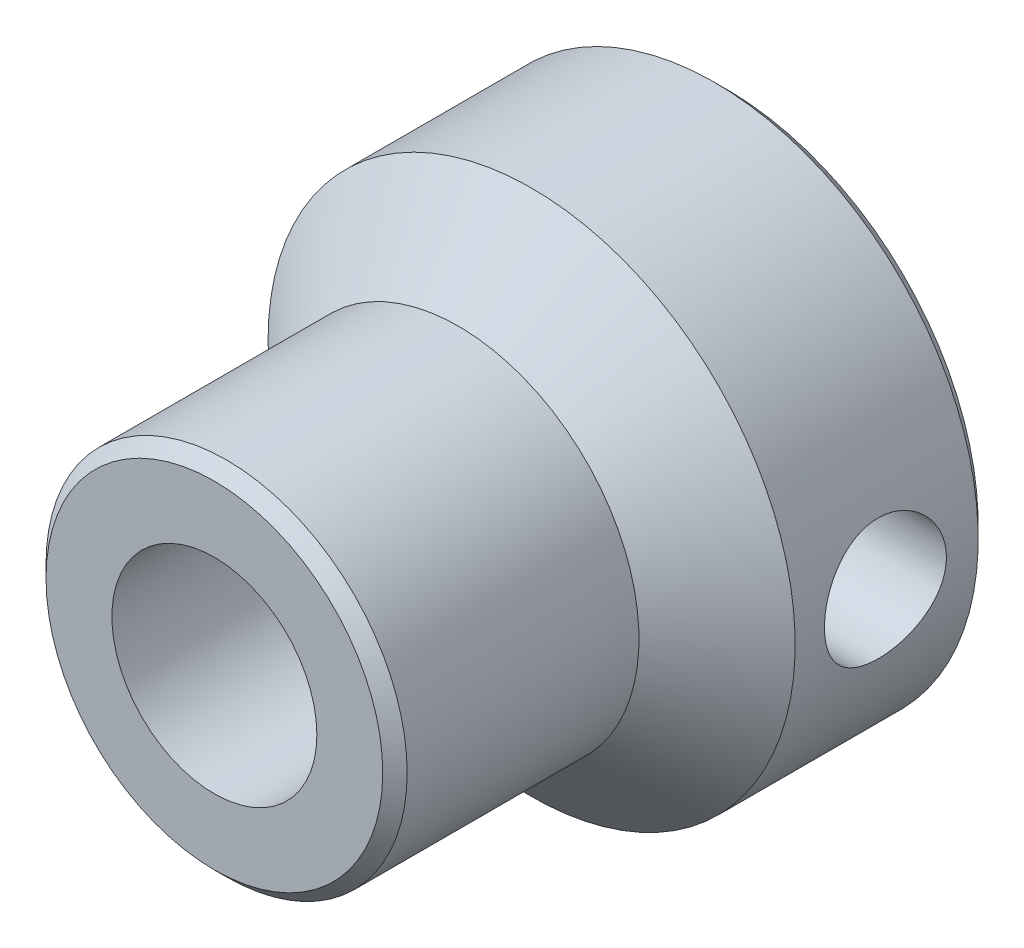
ISO-10303-21;
HEADER;
FILE_DESCRIPTION(('STEP AP214'),'2;1');
FILE_NAME('part.step','',(''),(''),'','','');
FILE_SCHEMA(('AUTOMOTIVE_DESIGN { 1 0 10303 214 1 1 1 1 }'));
ENDSEC;
DATA;
#1=APPLICATION_CONTEXT('core data for automotive mechanical design processes');
#2=APPLICATION_PROTOCOL_DEFINITION('international standard','automotive_design',2000,#1);
#3=PRODUCT_CONTEXT('',#1,'mechanical');
#4=PRODUCT('Part','Part','',(#3));
#5=PRODUCT_RELATED_PRODUCT_CATEGORY('part','',(#4));
#6=PRODUCT_DEFINITION_FORMATION('','',#4);
#7=PRODUCT_DEFINITION_CONTEXT('part definition',#1,'design');
#8=PRODUCT_DEFINITION('design','',#6,#7);
#9=PRODUCT_DEFINITION_SHAPE('','',#8);
#10=(LENGTH_UNIT() NAMED_UNIT(*) SI_UNIT(.MILLI.,.METRE.));
#11=(NAMED_UNIT(*) PLANE_ANGLE_UNIT() SI_UNIT($,.RADIAN.));
#12=(NAMED_UNIT(*) SI_UNIT($,.STERADIAN.) SOLID_ANGLE_UNIT());
#13=UNCERTAINTY_MEASURE_WITH_UNIT(LENGTH_MEASURE(1.E-05),#10,'distance_accuracy_value','');
#14=(GEOMETRIC_REPRESENTATION_CONTEXT(3) GLOBAL_UNCERTAINTY_ASSIGNED_CONTEXT((#13)) GLOBAL_UNIT_ASSIGNED_CONTEXT((#10,
#11,#12)) REPRESENTATION_CONTEXT('',''));
#15=CARTESIAN_POINT('',(0.,0.,0.));
#16=DIRECTION('',(0.,0.,1.));
#17=DIRECTION('',(1.,0.,0.));
#18=AXIS2_PLACEMENT_3D('',#15,#16,#17);
#19=CARTESIAN_POINT('',(0.,0.,0.));
#20=DIRECTION('',(0.,0.,-1.));
#21=DIRECTION('',(-1.,0.,0.));
#22=AXIS2_PLACEMENT_3D('',#19,#20,#21);
#23=CYLINDRICAL_SURFACE('',#22,2.5);
#24=CARTESIAN_POINT('',(-2.5,0.,3.4));
#25=CARTESIAN_POINT('',(-2.49999641755189,-0.065714953691233,3.39999587210062));
#26=CARTESIAN_POINT('',(-2.49738113774397,-0.131508249622541,3.3947874085979));
#27=CARTESIAN_POINT('',(-2.48717695046745,-0.261150294085531,3.37418389957385));
#28=CARTESIAN_POINT('',(-2.47957859786229,-0.324995108391879,3.35876950875294));
#29=CARTESIAN_POINT('',(-2.4602034925414,-0.448666931100718,3.31850773922901));
#30=CARTESIAN_POINT('',(-2.448442989719,-0.508508503673975,3.29369701968998));
#31=CARTESIAN_POINT('',(-2.42182220644723,-0.623090771008206,3.23553672329382));
#32=CARTESIAN_POINT('',(-2.40696217041913,-0.677831867487562,3.20218781968893));
#33=CARTESIAN_POINT('',(-2.37445322822571,-0.784384772202398,3.12560343814338));
#34=CARTESIAN_POINT('',(-2.3566899890942,-0.835819013902639,3.08189190095045));
#35=CARTESIAN_POINT('',(-2.32074962808431,-0.93097430608372,2.98684815094121));
#36=CARTESIAN_POINT('',(-2.30257220261294,-0.974689478883457,2.93551018528445));
#37=CARTESIAN_POINT('',(-2.26623688996684,-1.05656500056285,2.82189581309577));
#38=CARTESIAN_POINT('',(-2.24818983712665,-1.09403166943955,2.75907987706761));
#39=CARTESIAN_POINT('',(-2.21607473465401,-1.15771028361337,2.62704083001723));
#40=CARTESIAN_POINT('',(-2.20200384508737,-1.18393026870792,2.55782233909656));
#41=CARTESIAN_POINT('',(-2.18072333797261,-1.22266555273573,2.4191686182226));
#42=CARTESIAN_POINT('',(-2.17315339479642,-1.23590732135055,2.34999443491576));
#43=CARTESIAN_POINT('',(-2.1647736243566,-1.25053374163606,2.21002645277565));
#44=CARTESIAN_POINT('',(-2.1639571167911,-1.25193011046634,2.13923432391106));
#45=CARTESIAN_POINT('',(-2.16888662821561,-1.24335910896537,2.00714246960579));
#46=CARTESIAN_POINT('',(-2.17385954577517,-1.23473069942103,1.94571996097119));
#47=CARTESIAN_POINT('',(-2.18845285917313,-1.20867481132116,1.8253476132837));
#48=CARTESIAN_POINT('',(-2.1980747353972,-1.19124452987206,1.76639856836836));
#49=CARTESIAN_POINT('',(-2.22109345515926,-1.1477622254825,1.65096358429293));
#50=CARTESIAN_POINT('',(-2.23457300829998,-1.12151883389499,1.59456700151776));
#51=CARTESIAN_POINT('',(-2.26379255351755,-1.061302109585,1.48670713426249));
#52=CARTESIAN_POINT('',(-2.27953355975238,-1.02732530476558,1.43524608049989));
#53=CARTESIAN_POINT('',(-2.31391447379107,-0.947582568640985,1.33184843407097));
#54=CARTESIAN_POINT('',(-2.33266887795933,-0.900868072961601,1.2806789080298));
#55=CARTESIAN_POINT('',(-2.36934529125509,-0.799444473426716,1.18658072676137));
#56=CARTESIAN_POINT('',(-2.38726689948501,-0.744731570717856,1.14365600995765));
#57=CARTESIAN_POINT('',(-2.42127484103705,-0.62564563228981,1.06539292371284));
#58=CARTESIAN_POINT('',(-2.43723730202509,-0.56094198949926,1.03049940944283));
#59=CARTESIAN_POINT('',(-2.46447351401553,-0.425582769360996,0.97237871369624));
#60=CARTESIAN_POINT('',(-2.47575098679441,-0.354931970331596,0.949142268731042));
#61=CARTESIAN_POINT('',(-2.49155417176795,-0.215958114575877,0.916905745354157));
#62=CARTESIAN_POINT('',(-2.4965617287664,-0.147926913185405,0.906885955316528));
#63=CARTESIAN_POINT('',(-2.50091266823877,-0.0109744999366921,0.898169086081889));
#64=CARTESIAN_POINT('',(-2.5002587340164,0.0579462748373765,0.899466642950652));
#65=CARTESIAN_POINT('',(-2.49363990316801,0.189041214982491,0.912758360523443));
#66=CARTESIAN_POINT('',(-2.48809057110237,0.251324260062442,0.923915665912539));
#67=CARTESIAN_POINT('',(-2.47277714143524,0.373008615377395,0.955297589868858));
#68=CARTESIAN_POINT('',(-2.46301257917916,0.432409607113745,0.9755232080667));
#69=CARTESIAN_POINT('',(-2.43980314267087,0.548610760562081,1.02499808304147));
#70=CARTESIAN_POINT('',(-2.42626102212424,0.605287996257691,1.05448881264602));
#71=CARTESIAN_POINT('',(-2.39679967896386,0.71307670212365,1.12138441955755));
#72=CARTESIAN_POINT('',(-2.38087944457231,0.764185787219101,1.15879266824179));
#73=CARTESIAN_POINT('',(-2.34635276671831,0.864709611613315,1.24470053166609));
#74=CARTESIAN_POINT('',(-2.32763606060552,0.913465097280798,1.29392858556696));
#75=CARTESIAN_POINT('',(-2.29077989504843,1.00232040139155,1.39990643908663));
#76=CARTESIAN_POINT('',(-2.27264084226908,1.04241423211355,1.45666139852047));
#77=CARTESIAN_POINT('',(-2.23813990282585,1.11463489312212,1.57955456775039));
#78=CARTESIAN_POINT('',(-2.2219066207934,1.1462818698483,1.64601408276074));
#79=CARTESIAN_POINT('',(-2.19467590460158,1.19760353251725,1.78438758461565));
#80=CARTESIAN_POINT('',(-2.18367172800773,1.21729364485946,1.85629440812648));
#81=CARTESIAN_POINT('',(-2.16951876260834,1.2423271093121,1.99613777857681));
#82=CARTESIAN_POINT('',(-2.16571729325614,1.24886624550108,2.06379281678629));
#83=CARTESIAN_POINT('',(-2.16456693307719,1.25086144297598,2.19930883396341));
#84=CARTESIAN_POINT('',(-2.16721524534441,1.2463223082805,2.26716971092429));
#85=CARTESIAN_POINT('',(-2.17797327562531,1.22740765699033,2.39435437691502));
#86=CARTESIAN_POINT('',(-2.18553868102992,1.2140103929285,2.4538755876805));
#87=CARTESIAN_POINT('',(-2.20463770234897,1.17896919778081,2.56976014928088));
#88=CARTESIAN_POINT('',(-2.21617259462095,1.15732261394976,2.62612247761496));
#89=CARTESIAN_POINT('',(-2.2428566295566,1.10476968162585,2.73828106373326));
#90=CARTESIAN_POINT('',(-2.25819652995238,1.07333892227057,2.79378487728713));
#91=CARTESIAN_POINT('',(-2.29044164543238,1.00268871454579,2.89909317022573));
#92=CARTESIAN_POINT('',(-2.30734767243153,0.963465214048309,2.94889466314811));
#93=CARTESIAN_POINT('',(-2.34327903949141,0.872754158330801,3.04767747794702));
#94=CARTESIAN_POINT('',(-2.36231229139336,0.820355528762713,3.0958238779524));
#95=CARTESIAN_POINT('',(-2.3984719031886,0.707693507775349,3.18282872927954));
#96=CARTESIAN_POINT('',(-2.4155972326005,0.647425904070981,3.22168217428286));
#97=CARTESIAN_POINT('',(-2.44622511981379,0.519914496024933,3.28904545345275));
#98=CARTESIAN_POINT('',(-2.45970120703636,0.452624379918267,3.31748021176429));
#99=CARTESIAN_POINT('',(-2.48126676704332,0.313427626617739,3.36226020989869));
#100=CARTESIAN_POINT('',(-2.48937154216165,0.241534749528957,3.37863980853697));
#101=CARTESIAN_POINT('',(-2.49619327387079,0.14075243310423,3.39237176384481));
#102=CARTESIAN_POINT('',(-2.49761706674002,0.112702349299373,3.39522830107952));
#103=CARTESIAN_POINT('',(-2.49952121222331,0.0564396647589469,3.39904333189601));
#104=CARTESIAN_POINT('',(-2.50000153879704,0.0282270595592267,3.400001773089));
#105=CARTESIAN_POINT('',(-2.5,0.,3.4));
#106=B_SPLINE_CURVE_WITH_KNOTS('',3,(#24,#25,#26,#27,#28,#29,#30,#31,#32,#33,#34,#35,#36,#37,
#38,#39,#40,#41,#42,#43,#44,#45,#46,#47,#48,#49,#50,#51,#52,#53,#54,#55,#56,#57,#58,#59,#60,#61,
#62,#63,#64,#65,#66,#67,#68,#69,#70,#71,#72,#73,#74,#75,#76,#77,#78,#79,#80,#81,#82,#83,#84,#85,
#86,#87,#88,#89,#90,#91,#92,#93,#94,#95,#96,#97,#98,#99,#100,#101,#102,#103,#104,#105),
.UNSPECIFIED.,.T.,.F.,(4,2,2,2,2,2,2,2,2,2,2,2,2,2,2,2,2,2,2,2,2,2,2,2,2,2,2,2,2,2,2,2,2,2,2,2,
2,2,2,2,4),(0.,0.197030321775365,0.394435187136497,0.591077694365372,0.787704700726959,
0.99622719839761,1.20490779706754,1.42977158038441,1.65447434872851,1.86572515175287,
2.07676696661275,2.2625714051165,2.44843504907098,2.63862800210609,2.82890651575277,
3.04331176667348,3.25781918248357,3.4822877776805,3.70657771140349,3.91229113089182,
4.11790705639345,4.30758633132652,4.49728652038664,4.69241070034873,4.88761813435424,
5.10199513305523,5.31651985769289,5.54143352699592,5.76605639925971,5.96911634372966,
6.17208824825006,6.35572412805228,6.53941910979597,6.73545570969517,6.93159451423697,
7.15156553440622,7.37165479220715,7.59330017078656,7.81431135781162,7.89894100172121,
7.98357298143558),.UNSPECIFIED.);
#107=CARTESIAN_POINT('',(-2.5,0.,3.4));
#108=VERTEX_POINT('',#107);
#109=EDGE_CURVE('E278',#108,#108,#106,.T.);
#110=ORIENTED_EDGE('',*,*,#109,.F.);
#111=EDGE_LOOP('',(#110));
#112=FACE_BOUND('',#111,.T.);
#113=CARTESIAN_POINT('',(2.5,0.,0.900000000000001));
#114=CARTESIAN_POINT('',(2.49999641755189,-0.065714953691233,0.900004127899377));
#115=CARTESIAN_POINT('',(2.49738113774397,-0.13150824962254,0.905212591402095));
#116=CARTESIAN_POINT('',(2.48717695046745,-0.261150294085531,0.925816100426148));
#117=CARTESIAN_POINT('',(2.47957859786229,-0.324995108391879,0.941230491247063));
#118=CARTESIAN_POINT('',(2.4602034925414,-0.448666931100718,0.981492260770994));
#119=CARTESIAN_POINT('',(2.448442989719,-0.508508503673974,1.00630298031002));
#120=CARTESIAN_POINT('',(2.42182220644723,-0.623090771008206,1.06446327670618));
#121=CARTESIAN_POINT('',(2.40696217041913,-0.677831867487562,1.09781218031107));
#122=CARTESIAN_POINT('',(2.37445322822571,-0.784384772202398,1.17439656185662));
#123=CARTESIAN_POINT('',(2.3566899890942,-0.835819013902639,1.21810809904955));
#124=CARTESIAN_POINT('',(2.32074962808431,-0.930974306083721,1.31315184905879));
#125=CARTESIAN_POINT('',(2.30257220261294,-0.974689478883457,1.36448981471555));
#126=CARTESIAN_POINT('',(2.26623688996684,-1.05656500056285,1.47810418690423));
#127=CARTESIAN_POINT('',(2.24818983712665,-1.09403166943955,1.54092012293239));
#128=CARTESIAN_POINT('',(2.21607473465401,-1.15771028361337,1.67295916998277));
#129=CARTESIAN_POINT('',(2.20200384508737,-1.18393026870792,1.74217766090344));
#130=CARTESIAN_POINT('',(2.18072333797261,-1.22266555273573,1.8808313817774));
#131=CARTESIAN_POINT('',(2.17315339479642,-1.23590732135055,1.95000556508424));
#132=CARTESIAN_POINT('',(2.1647736243566,-1.25053374163606,2.08997354722435));
#133=CARTESIAN_POINT('',(2.1639571167911,-1.25193011046634,2.16076567608894));
#134=CARTESIAN_POINT('',(2.16888662821561,-1.24335910896537,2.29285753039421));
#135=CARTESIAN_POINT('',(2.17385954577517,-1.23473069942103,2.35428003902881));
#136=CARTESIAN_POINT('',(2.18845285917313,-1.20867481132116,2.4746523867163));
#137=CARTESIAN_POINT('',(2.1980747353972,-1.19124452987206,2.53360143163164));
#138=CARTESIAN_POINT('',(2.22109345515926,-1.1477622254825,2.64903641570707));
#139=CARTESIAN_POINT('',(2.23457300829998,-1.12151883389499,2.70543299848224));
#140=CARTESIAN_POINT('',(2.26379255351755,-1.061302109585,2.81329286573751));
#141=CARTESIAN_POINT('',(2.27953355975238,-1.02732530476558,2.86475391950011));
#142=CARTESIAN_POINT('',(2.31391447379107,-0.947582568640985,2.96815156592903));
#143=CARTESIAN_POINT('',(2.33266887795933,-0.900868072961601,3.0193210919702));
#144=CARTESIAN_POINT('',(2.36934529125509,-0.799444473426716,3.11341927323863));
#145=CARTESIAN_POINT('',(2.38726689948501,-0.744731570717856,3.15634399004235));
#146=CARTESIAN_POINT('',(2.42127484103705,-0.62564563228981,3.23460707628716));
#147=CARTESIAN_POINT('',(2.43723730202509,-0.56094198949926,3.26950059055717));
#148=CARTESIAN_POINT('',(2.46447351401553,-0.425582769360996,3.32762128630376));
#149=CARTESIAN_POINT('',(2.47575098679441,-0.354931970331595,3.35085773126896));
#150=CARTESIAN_POINT('',(2.49155417176795,-0.215958114575877,3.38309425464584));
#151=CARTESIAN_POINT('',(2.4965617287664,-0.147926913185405,3.39311404468347));
#152=CARTESIAN_POINT('',(2.50091266823877,-0.0109744999366919,3.40183091391811));
#153=CARTESIAN_POINT('',(2.5002587340164,0.0579462748373767,3.40053335704935));
#154=CARTESIAN_POINT('',(2.49363990316801,0.189041214982492,3.38724163947656));
#155=CARTESIAN_POINT('',(2.48809057110237,0.251324260062442,3.37608433408746));
#156=CARTESIAN_POINT('',(2.47277714143524,0.373008615377395,3.34470241013114));
#157=CARTESIAN_POINT('',(2.46301257917916,0.432409607113746,3.3244767919333));
#158=CARTESIAN_POINT('',(2.43980314267087,0.548610760562081,3.27500191695853));
#159=CARTESIAN_POINT('',(2.42626102212424,0.605287996257692,3.24551118735398));
#160=CARTESIAN_POINT('',(2.39679967896386,0.713076702123651,3.17861558044245));
#161=CARTESIAN_POINT('',(2.38087944457231,0.764185787219102,3.14120733175821));
#162=CARTESIAN_POINT('',(2.34635276671831,0.864709611613316,3.05529946833391));
#163=CARTESIAN_POINT('',(2.32763606060552,0.913465097280798,3.00607141443304));
#164=CARTESIAN_POINT('',(2.29077989504843,1.00232040139155,2.90009356091337));
#165=CARTESIAN_POINT('',(2.27264084226908,1.04241423211355,2.84333860147953));
#166=CARTESIAN_POINT('',(2.23813990282585,1.11463489312212,2.72044543224961));
#167=CARTESIAN_POINT('',(2.2219066207934,1.1462818698483,2.65398591723926));
#168=CARTESIAN_POINT('',(2.19467590460158,1.19760353251725,2.51561241538435));
#169=CARTESIAN_POINT('',(2.18367172800773,1.21729364485946,2.44370559187352));
#170=CARTESIAN_POINT('',(2.16951876260834,1.2423271093121,2.30386222142319));
#171=CARTESIAN_POINT('',(2.16571729325614,1.24886624550108,2.2362071832137));
#172=CARTESIAN_POINT('',(2.16456693307719,1.25086144297598,2.10069116603659));
#173=CARTESIAN_POINT('',(2.16721524534441,1.2463223082805,2.03283028907571));
#174=CARTESIAN_POINT('',(2.17797327562531,1.22740765699033,1.90564562308498));
#175=CARTESIAN_POINT('',(2.18553868102992,1.2140103929285,1.8461244123195));
#176=CARTESIAN_POINT('',(2.20463770234897,1.17896919778081,1.73023985071912));
#177=CARTESIAN_POINT('',(2.21617259462095,1.15732261394976,1.67387752238504));
#178=CARTESIAN_POINT('',(2.2428566295566,1.10476968162585,1.56171893626674));
#179=CARTESIAN_POINT('',(2.25819652995238,1.07333892227057,1.50621512271287));
#180=CARTESIAN_POINT('',(2.29044164543238,1.00268871454579,1.40090682977427));
#181=CARTESIAN_POINT('',(2.30734767243153,0.963465214048309,1.35110533685189));
#182=CARTESIAN_POINT('',(2.34327903949141,0.8727541583308,1.25232252205298));
#183=CARTESIAN_POINT('',(2.36231229139336,0.820355528762713,1.2041761220476));
#184=CARTESIAN_POINT('',(2.3984719031886,0.707693507775349,1.11717127072046));
#185=CARTESIAN_POINT('',(2.4155972326005,0.64742590407098,1.07831782571714));
#186=CARTESIAN_POINT('',(2.44622511981379,0.519914496024933,1.01095454654725));
#187=CARTESIAN_POINT('',(2.45970120703636,0.452624379918267,0.982519788235708));
#188=CARTESIAN_POINT('',(2.48126676704332,0.313427626617739,0.937739790101311));
#189=CARTESIAN_POINT('',(2.48937154216165,0.241534749528957,0.921360191463029));
#190=CARTESIAN_POINT('',(2.49619327387079,0.140752433104229,0.907628236155189));
#191=CARTESIAN_POINT('',(2.49761706674002,0.112702349299373,0.904771698920477));
#192=CARTESIAN_POINT('',(2.49952121222331,0.0564396647589469,0.900956668103994));
#193=CARTESIAN_POINT('',(2.50000153879704,0.0282270595592266,0.899998226911001));
#194=CARTESIAN_POINT('',(2.5,0.,0.900000000000001));
#195=B_SPLINE_CURVE_WITH_KNOTS('',3,(#113,#114,#115,#116,#117,#118,#119,#120,#121,#122,#123,
#124,#125,#126,#127,#128,#129,#130,#131,#132,#133,#134,#135,#136,#137,#138,#139,#140,#141,#142,
#143,#144,#145,#146,#147,#148,#149,#150,#151,#152,#153,#154,#155,#156,#157,#158,#159,#160,#161,
#162,#163,#164,#165,#166,#167,#168,#169,#170,#171,#172,#173,#174,#175,#176,#177,#178,#179,#180,
#181,#182,#183,#184,#185,#186,#187,#188,#189,#190,#191,#192,#193,#194),.UNSPECIFIED.,.T.,.F.,(4,
2,2,2,2,2,2,2,2,2,2,2,2,2,2,2,2,2,2,2,2,2,2,2,2,2,2,2,2,2,2,2,2,2,2,2,2,2,2,2,4),(0.,
0.197030321775365,0.394435187136497,0.591077694365372,0.787704700726959,0.99622719839761,
1.20490779706754,1.42977158038441,1.65447434872851,1.86572515175287,2.07676696661275,
2.26257140511651,2.44843504907098,2.63862800210609,2.82890651575277,3.04331176667348,
3.25781918248358,3.4822877776805,3.70657771140349,3.91229113089182,4.11790705639345,
4.30758633132652,4.49728652038664,4.69241070034873,4.88761813435424,5.10199513305523,
5.31651985769289,5.54143352699592,5.76605639925972,5.96911634372966,6.17208824825006,
6.35572412805228,6.53941910979597,6.73545570969517,6.93159451423697,7.15156553440623,
7.37165479220715,7.59330017078656,7.81431135781162,7.89894100172122,7.98357298143558),.UNSPECIFIED.);
#196=CARTESIAN_POINT('',(2.5,0.,0.900000000000001));
#197=VERTEX_POINT('',#196);
#198=EDGE_CURVE('E89',#197,#197,#195,.T.);
#199=ORIENTED_EDGE('',*,*,#198,.F.);
#200=EDGE_LOOP('',(#199));
#201=FACE_BOUND('',#200,.T.);
#202=CARTESIAN_POINT('',(0.,0.,0.));
#203=DIRECTION('',(0.,0.,-1.));
#204=DIRECTION('',(-1.,0.,0.));
#205=AXIS2_PLACEMENT_3D('',#202,#203,#204);
#206=CIRCLE('',#205,2.5);
#207=CARTESIAN_POINT('',(-2.5,0.,0.));
#208=VERTEX_POINT('',#207);
#209=EDGE_CURVE('E72',#208,#208,#206,.T.);
#210=ORIENTED_EDGE('',*,*,#209,.T.);
#211=EDGE_LOOP('',(#210));
#212=FACE_BOUND('',#211,.T.);
#213=CARTESIAN_POINT('',(0.,0.,5.));
#214=DIRECTION('',(0.,0.,-1.));
#215=DIRECTION('',(-1.,0.,0.));
#216=AXIS2_PLACEMENT_3D('',#213,#214,#215);
#217=CIRCLE('',#216,2.5);
#218=CARTESIAN_POINT('',(-2.5,0.,5.));
#219=VERTEX_POINT('',#218);
#220=EDGE_CURVE('E63',#219,#219,#217,.T.);
#221=ORIENTED_EDGE('',*,*,#220,.F.);
#222=EDGE_LOOP('',(#221));
#223=FACE_BOUND('',#222,.T.);
#224=ADVANCED_FACE('F42',(#112,#201,#212,#223),#23,.F.);
#225=CARTESIAN_POINT('',(-1.,0.,5.));
#226=DIRECTION('',(0.,0.,-1.));
#227=DIRECTION('',(-1.,0.,0.));
#228=AXIS2_PLACEMENT_3D('',#225,#226,#227);
#229=PLANE('',#228);
#230=CARTESIAN_POINT('',(0.,0.,5.));
#231=DIRECTION('',(0.,0.,-1.));
#232=DIRECTION('',(-1.,0.,0.));
#233=AXIS2_PLACEMENT_3D('',#230,#231,#232);
#234=CIRCLE('',#233,2.09999999999999);
#235=CARTESIAN_POINT('',(-2.09999999999999,0.,5.));
#236=VERTEX_POINT('',#235);
#237=EDGE_CURVE('E75',#236,#236,#234,.T.);
#238=ORIENTED_EDGE('',*,*,#237,.F.);
#239=EDGE_LOOP('',(#238));
#240=FACE_BOUND('',#239,.T.);
#241=ORIENTED_EDGE('',*,*,#220,.T.);
#242=EDGE_LOOP('',(#241));
#243=FACE_BOUND('',#242,.T.);
#244=ADVANCED_FACE('F123',(#240,#243),#229,.T.);
#245=CARTESIAN_POINT('',(-1.,0.,10.5));
#246=DIRECTION('',(0.,0.,1.));
#247=DIRECTION('',(1.,0.,0.));
#248=AXIS2_PLACEMENT_3D('',#245,#246,#247);
#249=PLANE('',#248);
#250=CARTESIAN_POINT('',(0.,0.,10.5));
#251=DIRECTION('',(0.,0.,1.));
#252=DIRECTION('',(1.,0.,0.));
#253=AXIS2_PLACEMENT_3D('',#250,#251,#252);
#254=CIRCLE('',#253,3.45);
#255=CARTESIAN_POINT('',(3.45,0.,10.5));
#256=VERTEX_POINT('',#255);
#257=EDGE_CURVE('E10',#256,#256,#254,.T.);
#258=ORIENTED_EDGE('',*,*,#257,.T.);
#259=EDGE_LOOP('',(#258));
#260=FACE_BOUND('',#259,.T.);
#261=CARTESIAN_POINT('',(0.,0.,10.5));
#262=DIRECTION('',(0.,0.,1.));
#263=DIRECTION('',(1.,0.,0.));
#264=AXIS2_PLACEMENT_3D('',#261,#262,#263);
#265=CIRCLE('',#264,2.09999999999999);
#266=CARTESIAN_POINT('',(2.09999999999999,0.,10.5));
#267=VERTEX_POINT('',#266);
#268=EDGE_CURVE('E78',#267,#267,#265,.T.);
#269=ORIENTED_EDGE('',*,*,#268,.F.);
#270=EDGE_LOOP('',(#269));
#271=FACE_BOUND('',#270,.T.);
#272=ADVANCED_FACE('F129',(#260,#271),#249,.T.);
#273=CARTESIAN_POINT('',(0.,0.,0.));
#274=DIRECTION('',(0.,0.,-1.));
#275=DIRECTION('',(-1.,0.,0.));
#276=AXIS2_PLACEMENT_3D('',#273,#274,#275);
#277=CYLINDRICAL_SURFACE('',#276,3.7);
#278=CARTESIAN_POINT('',(0.,0.,10.25));
#279=DIRECTION('',(0.,0.,1.));
#280=DIRECTION('',(1.,0.,0.));
#281=AXIS2_PLACEMENT_3D('',#278,#279,#280);
#282=CIRCLE('',#281,3.7);
#283=CARTESIAN_POINT('',(3.7,0.,10.25));
#284=VERTEX_POINT('',#283);
#285=EDGE_CURVE('E50',#284,#284,#282,.F.);
#286=ORIENTED_EDGE('',*,*,#285,.T.);
#287=EDGE_LOOP('',(#286));
#288=FACE_BOUND('',#287,.T.);
#289=CARTESIAN_POINT('',(0.,0.,5.5));
#290=DIRECTION('',(0.,0.,-1.));
#291=DIRECTION('',(-1.,0.,0.));
#292=AXIS2_PLACEMENT_3D('',#289,#290,#291);
#293=CIRCLE('',#292,3.7);
#294=CARTESIAN_POINT('',(-3.7,0.,5.5));
#295=VERTEX_POINT('',#294);
#296=EDGE_CURVE('E66',#295,#295,#293,.T.);
#297=ORIENTED_EDGE('',*,*,#296,.F.);
#298=EDGE_LOOP('',(#297));
#299=FACE_BOUND('',#298,.T.);
#300=ADVANCED_FACE('F160',(#288,#299),#277,.T.);
#301=CARTESIAN_POINT('',(0.,0.,4.));
#302=DIRECTION('',(0.,0.,-1.));
#303=DIRECTION('',(-1.,0.,0.));
#304=AXIS2_PLACEMENT_3D('',#301,#302,#303);
#305=CONICAL_SURFACE('',#304,5.4,0.847816973393405);
#306=ORIENTED_EDGE('',*,*,#296,.T.);
#307=EDGE_LOOP('',(#306));
#308=FACE_BOUND('',#307,.T.);
#309=CARTESIAN_POINT('',(0.,0.,4.));
#310=DIRECTION('',(0.,0.,-1.));
#311=DIRECTION('',(-1.,0.,0.));
#312=AXIS2_PLACEMENT_3D('',#309,#310,#311);
#313=CIRCLE('',#312,5.4);
#314=CARTESIAN_POINT('',(-5.4,0.,4.));
#315=VERTEX_POINT('',#314);
#316=EDGE_CURVE('E69',#315,#315,#313,.T.);
#317=ORIENTED_EDGE('',*,*,#316,.F.);
#318=EDGE_LOOP('',(#317));
#319=FACE_BOUND('',#318,.T.);
#320=ADVANCED_FACE('F119',(#308,#319),#305,.T.);
#321=CARTESIAN_POINT('',(0.,0.,0.));
#322=DIRECTION('',(0.,0.,-1.));
#323=DIRECTION('',(-1.,0.,0.));
#324=AXIS2_PLACEMENT_3D('',#321,#322,#323);
#325=CYLINDRICAL_SURFACE('',#324,5.4);
#326=CARTESIAN_POINT('',(0.,0.,0.249999999999991));
#327=DIRECTION('',(0.,0.,-1.));
#328=DIRECTION('',(-1.,0.,0.));
#329=AXIS2_PLACEMENT_3D('',#326,#327,#328);
#330=CIRCLE('',#329,5.4);
#331=CARTESIAN_POINT('',(-5.4,0.,0.249999999999991));
#332=VERTEX_POINT('',#331);
#333=EDGE_CURVE('E54',#332,#332,#330,.F.);
#334=ORIENTED_EDGE('',*,*,#333,.T.);
#335=EDGE_LOOP('',(#334));
#336=FACE_BOUND('',#335,.T.);
#337=CARTESIAN_POINT('',(-5.4,0.,3.4));
#338=CARTESIAN_POINT('',(-5.39999874823438,0.0692241871145403,3.39999778822904));
#339=CARTESIAN_POINT('',(-5.39865546800572,0.138474266427772,3.39423022207203));
#340=CARTESIAN_POINT('',(-5.39342675426803,0.275000425366631,3.37134043929941));
#341=CARTESIAN_POINT('',(-5.38953965210246,0.342275178961732,3.35421076944861));
#342=CARTESIAN_POINT('',(-5.37965516979212,0.472858483968851,3.30916755790865));
#343=CARTESIAN_POINT('',(-5.37366012568423,0.536171334869417,3.28126595042019));
#344=CARTESIAN_POINT('',(-5.36020341061013,0.657216106152046,3.21551041862905));
#345=CARTESIAN_POINT('',(-5.35274174258654,0.714948037731248,3.17765651429448));
#346=CARTESIAN_POINT('',(-5.33701743019704,0.824223728513663,3.0923565507572));
#347=CARTESIAN_POINT('',(-5.32874387739558,0.875653654684865,3.0447666629363));
#348=CARTESIAN_POINT('',(-5.31240337894845,0.969877453577131,2.94165408188479));
#349=CARTESIAN_POINT('',(-5.30433645361578,1.01267048005084,2.88613061222766));
#350=CARTESIAN_POINT('',(-5.2892141261743,1.08892093571322,2.76786874450375));
#351=CARTESIAN_POINT('',(-5.28217265376136,1.12225476741282,2.70504871438924));
#352=CARTESIAN_POINT('',(-5.27005610560817,1.17784701650963,2.57450821814353));
#353=CARTESIAN_POINT('',(-5.26498076415844,1.20010693058863,2.50678841565295));
#354=CARTESIAN_POINT('',(-5.25748265119255,1.23253847327747,2.36961236657041));
#355=CARTESIAN_POINT('',(-5.2550154349981,1.24291290618177,2.30020655062519));
#356=CARTESIAN_POINT('',(-5.25287961956346,1.25191004217409,2.16059909833359));
#357=CARTESIAN_POINT('',(-5.25321063325227,1.25053437061961,2.09039757339692));
#358=CARTESIAN_POINT('',(-5.25659375047557,1.23623300176578,1.95271715578438));
#359=CARTESIAN_POINT('',(-5.25958979574762,1.22354523877694,1.88521195929967));
#360=CARTESIAN_POINT('',(-5.2678764915052,1.18735782432143,1.75331512329875));
#361=CARTESIAN_POINT('',(-5.2731672844797,1.16385750145935,1.68892367740228));
#362=CARTESIAN_POINT('',(-5.28550107960884,1.10649981926167,1.56442546906195));
#363=CARTESIAN_POINT('',(-5.29255911403959,1.07255300269372,1.50436147197518));
#364=CARTESIAN_POINT('',(-5.30762320463089,0.995328718186157,1.39069540145175));
#365=CARTESIAN_POINT('',(-5.31562940449809,0.952049835034112,1.33709431004231));
#366=CARTESIAN_POINT('',(-5.33192650722274,0.856141032424574,1.2365081306382));
#367=CARTESIAN_POINT('',(-5.34021959983535,0.803309372870151,1.18971554598428));
#368=CARTESIAN_POINT('',(-5.35597952063802,0.690452447512654,1.10562098500938));
#369=CARTESIAN_POINT('',(-5.36344633016309,0.630427019272688,1.06831922305269));
#370=CARTESIAN_POINT('',(-5.37674137922928,0.504635960206346,1.00420865352397));
#371=CARTESIAN_POINT('',(-5.38256529931455,0.43885578247979,0.977427435210715));
#372=CARTESIAN_POINT('',(-5.39188660170977,0.303563395155949,0.935353729971639));
#373=CARTESIAN_POINT('',(-5.39538436395879,0.234051797029328,0.920059366806916));
#374=CARTESIAN_POINT('',(-5.39960432194415,0.0949188474226053,0.901678993176806));
#375=CARTESIAN_POINT('',(-5.40038621683971,0.0253339536305767,0.898330351116326));
#376=CARTESIAN_POINT('',(-5.39925471054082,-0.113401199396408,0.903221298340919));
#377=CARTESIAN_POINT('',(-5.39734151538226,-0.182551491450132,0.911460001789439));
#378=CARTESIAN_POINT('',(-5.39107270805315,-0.317567653128892,0.939074433096551));
#379=CARTESIAN_POINT('',(-5.38674779900457,-0.383463694391253,0.958310234904449));
#380=CARTESIAN_POINT('',(-5.37614070405043,-0.511092660604727,1.00721574982857));
#381=CARTESIAN_POINT('',(-5.3698583382899,-0.572825202371076,1.03688642175331));
#382=CARTESIAN_POINT('',(-5.35588743525236,-0.691444779334463,1.10635152267618));
#383=CARTESIAN_POINT('',(-5.34817839030347,-0.748240639647342,1.14629742389351));
#384=CARTESIAN_POINT('',(-5.33224710804932,-0.854416896018497,1.23498195450348));
#385=CARTESIAN_POINT('',(-5.32402479563046,-0.903796203090457,1.28372187282975));
#386=CARTESIAN_POINT('',(-5.30778399091491,-0.994793544081783,1.38982216341076));
#387=CARTESIAN_POINT('',(-5.29977329933032,-1.0362287089936,1.44734080199619));
#388=CARTESIAN_POINT('',(-5.28505640511214,-1.10885407052095,1.56867326774298));
#389=CARTESIAN_POINT('',(-5.27835014441881,-1.14004472315851,1.63248681452967));
#390=CARTESIAN_POINT('',(-5.26706995749014,-1.19107407331668,1.76424946837316));
#391=CARTESIAN_POINT('',(-5.2624836492151,-1.21097884732069,1.83217187160618));
#392=CARTESIAN_POINT('',(-5.2559438279697,-1.23905858603521,1.97051879217987));
#393=CARTESIAN_POINT('',(-5.25398983488665,-1.24723568979417,2.04094285083346));
#394=CARTESIAN_POINT('',(-5.25296867632895,-1.2515285845306,2.18044384980091));
#395=CARTESIAN_POINT('',(-5.25383190937952,-1.24793516606778,2.2495114869658));
#396=CARTESIAN_POINT('',(-5.25818914739366,-1.22944516739717,2.38602790471553));
#397=CARTESIAN_POINT('',(-5.26168311330701,-1.21454875496928,2.45347670931475));
#398=CARTESIAN_POINT('',(-5.27087224339566,-1.17402355997323,2.58457638910462));
#399=CARTESIAN_POINT('',(-5.27655773123556,-1.1484419154902,2.6482425593452));
#400=CARTESIAN_POINT('',(-5.28949203841655,-1.08731126166201,2.77042080878085));
#401=CARTESIAN_POINT('',(-5.2967410425912,-1.05176107372034,2.82893227745183));
#402=CARTESIAN_POINT('',(-5.31218981239259,-0.970758826498258,2.94056274138232));
#403=CARTESIAN_POINT('',(-5.32040732565605,-0.92510163582206,2.99353045904755));
#404=CARTESIAN_POINT('',(-5.33675342745657,-0.825590992830996,3.09114747275733));
#405=CARTESIAN_POINT('',(-5.34488199482159,-0.771735632696652,3.13579482715316));
#406=CARTESIAN_POINT('',(-5.36027855985255,-0.656388355565246,3.21614643938877));
#407=CARTESIAN_POINT('',(-5.36753191208641,-0.594794510125285,3.25170736226895));
#408=CARTESIAN_POINT('',(-5.38021121124879,-0.466345339684814,3.31191412325139));
#409=CARTESIAN_POINT('',(-5.3856386038694,-0.399494229079048,3.33656860135646));
#410=CARTESIAN_POINT('',(-5.39315038381651,-0.277203903682884,3.37015323222038));
#411=CARTESIAN_POINT('',(-5.39570241420179,-0.222397521091904,3.38132333566444));
#412=CARTESIAN_POINT('',(-5.3991276811903,-0.111733009859767,3.39624740769058));
#413=CARTESIAN_POINT('',(-5.40000101037414,-0.0558749393909185,3.40000178525128));
#414=CARTESIAN_POINT('',(-5.4,0.,3.4));
#415=B_SPLINE_CURVE_WITH_KNOTS('',3,(#337,#338,#339,#340,#341,#342,#343,#344,#345,#346,#347,
#348,#349,#350,#351,#352,#353,#354,#355,#356,#357,#358,#359,#360,#361,#362,#363,#364,#365,#366,
#367,#368,#369,#370,#371,#372,#373,#374,#375,#376,#377,#378,#379,#380,#381,#382,#383,#384,#385,
#386,#387,#388,#389,#390,#391,#392,#393,#394,#395,#396,#397,#398,#399,#400,#401,#402,#403,#404,
#405,#406,#407,#408,#409,#410,#411,#412,#413,#414),.UNSPECIFIED.,.T.,.F.,(4,2,2,2,2,2,2,2,2,2,2,
2,2,2,2,2,2,2,2,2,2,2,2,2,2,2,2,2,2,2,2,2,2,2,2,2,2,2,4),(0.,0.207467946105603,
0.415072120385802,0.622446947561194,0.829821358666675,1.04051486741415,1.25122900999614,
1.46458145535715,1.67790505749033,1.88753176908611,2.09712948410295,2.30241996008224,
2.50772318509512,2.71483586958108,2.92197998492394,3.1341595790516,3.34634396514453,
3.55908113091197,3.77178354107411,3.97977975138832,4.1877600615439,4.39315114378166,
4.59856110332142,4.80719248561258,5.01585447175303,5.2288581378352,5.44185232103247,
5.65358623747827,5.86528153016325,6.07178671705002,6.27828883866533,6.48388943660925,
6.68951435329084,6.89977416821969,7.11008298832518,7.32352890318485,7.5368054236744,
7.70427432097336,7.87173398207459),.UNSPECIFIED.);
#416=CARTESIAN_POINT('',(-5.4,0.,3.4));
#417=VERTEX_POINT('',#416);
#418=EDGE_CURVE('E154',#417,#417,#415,.T.);
#419=ORIENTED_EDGE('',*,*,#418,.F.);
#420=EDGE_LOOP('',(#419));
#421=FACE_BOUND('',#420,.T.);
#422=CARTESIAN_POINT('',(5.4,0.,0.900000000000001));
#423=CARTESIAN_POINT('',(5.39999874823438,0.0692241871145404,0.900002211770963));
#424=CARTESIAN_POINT('',(5.39865546800572,0.138474266427772,0.905769777927965));
#425=CARTESIAN_POINT('',(5.39342675426803,0.275000425366631,0.928659560700592));
#426=CARTESIAN_POINT('',(5.38953965210246,0.342275178961732,0.945789230551391));
#427=CARTESIAN_POINT('',(5.37965516979212,0.472858483968851,0.990832442091347));
#428=CARTESIAN_POINT('',(5.37366012568423,0.536171334869416,1.01873404957981));
#429=CARTESIAN_POINT('',(5.36020341061013,0.657216106152046,1.08448958137095));
#430=CARTESIAN_POINT('',(5.35274174258654,0.714948037731248,1.12234348570552));
#431=CARTESIAN_POINT('',(5.33701743019704,0.824223728513662,1.2076434492428));
#432=CARTESIAN_POINT('',(5.32874387739558,0.875653654684865,1.2552333370637));
#433=CARTESIAN_POINT('',(5.31240337894845,0.969877453577131,1.35834591811521));
#434=CARTESIAN_POINT('',(5.30433645361578,1.01267048005084,1.41386938777234));
#435=CARTESIAN_POINT('',(5.2892141261743,1.08892093571322,1.53213125549625));
#436=CARTESIAN_POINT('',(5.28217265376136,1.12225476741282,1.59495128561076));
#437=CARTESIAN_POINT('',(5.27005610560817,1.17784701650963,1.72549178185647));
#438=CARTESIAN_POINT('',(5.26498076415844,1.20010693058863,1.79321158434705));
#439=CARTESIAN_POINT('',(5.25748265119255,1.23253847327747,1.93038763342959));
#440=CARTESIAN_POINT('',(5.2550154349981,1.24291290618177,1.99979344937481));
#441=CARTESIAN_POINT('',(5.25287961956346,1.25191004217409,2.13940090166641));
#442=CARTESIAN_POINT('',(5.25321063325227,1.25053437061961,2.20960242660308));
#443=CARTESIAN_POINT('',(5.25659375047557,1.23623300176578,2.34728284421562));
#444=CARTESIAN_POINT('',(5.25958979574762,1.22354523877694,2.41478804070032));
#445=CARTESIAN_POINT('',(5.2678764915052,1.18735782432143,2.54668487670125));
#446=CARTESIAN_POINT('',(5.2731672844797,1.16385750145935,2.61107632259772));
#447=CARTESIAN_POINT('',(5.28550107960884,1.10649981926167,2.73557453093805));
#448=CARTESIAN_POINT('',(5.29255911403959,1.07255300269372,2.79563852802482));
#449=CARTESIAN_POINT('',(5.30762320463089,0.995328718186157,2.90930459854825));
#450=CARTESIAN_POINT('',(5.31562940449809,0.952049835034112,2.96290568995769));
#451=CARTESIAN_POINT('',(5.33192650722274,0.856141032424574,3.0634918693618));
#452=CARTESIAN_POINT('',(5.34021959983535,0.803309372870151,3.11028445401572));
#453=CARTESIAN_POINT('',(5.35597952063802,0.690452447512654,3.19437901499062));
#454=CARTESIAN_POINT('',(5.36344633016309,0.630427019272688,3.23168077694731));
#455=CARTESIAN_POINT('',(5.37674137922928,0.504635960206347,3.29579134647603));
#456=CARTESIAN_POINT('',(5.38256529931455,0.438855782479791,3.32257256478929));
#457=CARTESIAN_POINT('',(5.39188660170977,0.30356339515595,3.36464627002836));
#458=CARTESIAN_POINT('',(5.39538436395879,0.234051797029328,3.37994063319308));
#459=CARTESIAN_POINT('',(5.39960432194415,0.0949188474226055,3.39832100682319));
#460=CARTESIAN_POINT('',(5.40038621683971,0.0253339536305771,3.40166964888367));
#461=CARTESIAN_POINT('',(5.39925471054082,-0.113401199396407,3.39677870165908));
#462=CARTESIAN_POINT('',(5.39734151538226,-0.182551491450131,3.38853999821056));
#463=CARTESIAN_POINT('',(5.39107270805315,-0.317567653128892,3.36092556690345));
#464=CARTESIAN_POINT('',(5.38674779900457,-0.383463694391253,3.34168976509555));
#465=CARTESIAN_POINT('',(5.37614070405043,-0.511092660604727,3.29278425017143));
#466=CARTESIAN_POINT('',(5.3698583382899,-0.572825202371076,3.26311357824669));
#467=CARTESIAN_POINT('',(5.35588743525236,-0.691444779334463,3.19364847732382));
#468=CARTESIAN_POINT('',(5.34817839030347,-0.748240639647342,3.15370257610649));
#469=CARTESIAN_POINT('',(5.33224710804932,-0.854416896018498,3.06501804549652));
#470=CARTESIAN_POINT('',(5.32402479563046,-0.903796203090457,3.01627812717025));
#471=CARTESIAN_POINT('',(5.30778399091491,-0.994793544081783,2.91017783658924));
#472=CARTESIAN_POINT('',(5.29977329933032,-1.0362287089936,2.85265919800381));
#473=CARTESIAN_POINT('',(5.28505640511214,-1.10885407052095,2.73132673225702));
#474=CARTESIAN_POINT('',(5.27835014441881,-1.14004472315851,2.66751318547033));
#475=CARTESIAN_POINT('',(5.26706995749014,-1.19107407331668,2.53575053162684));
#476=CARTESIAN_POINT('',(5.2624836492151,-1.21097884732069,2.46782812839382));
#477=CARTESIAN_POINT('',(5.2559438279697,-1.23905858603521,2.32948120782013));
#478=CARTESIAN_POINT('',(5.25398983488665,-1.24723568979417,2.25905714916654));
#479=CARTESIAN_POINT('',(5.25296867632895,-1.2515285845306,2.11955615019909));
#480=CARTESIAN_POINT('',(5.25383190937952,-1.24793516606778,2.0504885130342));
#481=CARTESIAN_POINT('',(5.25818914739366,-1.22944516739717,1.91397209528447));
#482=CARTESIAN_POINT('',(5.26168311330701,-1.21454875496928,1.84652329068526));
#483=CARTESIAN_POINT('',(5.27087224339566,-1.17402355997323,1.71542361089538));
#484=CARTESIAN_POINT('',(5.27655773123556,-1.14844191549021,1.65175744065481));
#485=CARTESIAN_POINT('',(5.28949203841655,-1.08731126166201,1.52957919121915));
#486=CARTESIAN_POINT('',(5.2967410425912,-1.05176107372034,1.47106772254817));
#487=CARTESIAN_POINT('',(5.31218981239259,-0.970758826498258,1.35943725861768));
#488=CARTESIAN_POINT('',(5.32040732565605,-0.92510163582206,1.30646954095245));
#489=CARTESIAN_POINT('',(5.33675342745657,-0.825590992830997,1.20885252724267));
#490=CARTESIAN_POINT('',(5.34488199482159,-0.771735632696653,1.16420517284684));
#491=CARTESIAN_POINT('',(5.36027855985255,-0.656388355565246,1.08385356061123));
#492=CARTESIAN_POINT('',(5.36753191208641,-0.594794510125286,1.04829263773105));
#493=CARTESIAN_POINT('',(5.38021121124879,-0.466345339684815,0.988085876748606));
#494=CARTESIAN_POINT('',(5.3856386038694,-0.399494229079049,0.963431398643538));
#495=CARTESIAN_POINT('',(5.39315038381651,-0.277203903682884,0.929846767779616));
#496=CARTESIAN_POINT('',(5.39570241420179,-0.222397521091905,0.918676664335558));
#497=CARTESIAN_POINT('',(5.3991276811903,-0.111733009859768,0.903752592309421));
#498=CARTESIAN_POINT('',(5.40000101037414,-0.0558749393909187,0.899998214748724));
#499=CARTESIAN_POINT('',(5.4,0.,0.900000000000001));
#500=B_SPLINE_CURVE_WITH_KNOTS('',3,(#422,#423,#424,#425,#426,#427,#428,#429,#430,#431,#432,
#433,#434,#435,#436,#437,#438,#439,#440,#441,#442,#443,#444,#445,#446,#447,#448,#449,#450,#451,
#452,#453,#454,#455,#456,#457,#458,#459,#460,#461,#462,#463,#464,#465,#466,#467,#468,#469,#470,
#471,#472,#473,#474,#475,#476,#477,#478,#479,#480,#481,#482,#483,#484,#485,#486,#487,#488,#489,
#490,#491,#492,#493,#494,#495,#496,#497,#498,#499),.UNSPECIFIED.,.T.,.F.,(4,2,2,2,2,2,2,2,2,2,2,
2,2,2,2,2,2,2,2,2,2,2,2,2,2,2,2,2,2,2,2,2,2,2,2,2,2,2,4),(0.,0.207467946105603,
0.415072120385803,0.622446947561193,0.829821358666675,1.04051486741415,1.25122900999614,
1.46458145535715,1.67790505749033,1.88753176908611,2.09712948410295,2.30241996008224,
2.50772318509512,2.71483586958108,2.92197998492395,3.1341595790516,3.34634396514453,
3.55908113091197,3.77178354107411,3.97977975138832,4.1877600615439,4.39315114378166,
4.59856110332142,4.80719248561258,5.01585447175303,5.2288581378352,5.44185232103247,
5.65358623747827,5.86528153016325,6.07178671705002,6.27828883866533,6.48388943660925,
6.68951435329084,6.89977416821969,7.11008298832519,7.32352890318486,7.53680542367441,
7.70427432097337,7.87173398207459),.UNSPECIFIED.);
#501=CARTESIAN_POINT('',(5.4,0.,0.900000000000001));
#502=VERTEX_POINT('',#501);
#503=EDGE_CURVE('E81',#502,#502,#500,.T.);
#504=ORIENTED_EDGE('',*,*,#503,.F.);
#505=EDGE_LOOP('',(#504));
#506=FACE_BOUND('',#505,.T.);
#507=ORIENTED_EDGE('',*,*,#316,.T.);
#508=EDGE_LOOP('',(#507));
#509=FACE_BOUND('',#508,.T.);
#510=ADVANCED_FACE('F95',(#336,#421,#506,#509),#325,.T.);
#511=CARTESIAN_POINT('',(-5.4,0.,0.));
#512=DIRECTION('',(0.,0.,-1.));
#513=DIRECTION('',(-1.,0.,0.));
#514=AXIS2_PLACEMENT_3D('',#511,#512,#513);
#515=PLANE('',#514);
#516=CARTESIAN_POINT('',(0.,0.,0.));
#517=DIRECTION('',(0.,0.,-1.));
#518=DIRECTION('',(-1.,0.,0.));
#519=AXIS2_PLACEMENT_3D('',#516,#517,#518);
#520=CIRCLE('',#519,5.15000000000001);
#521=CARTESIAN_POINT('',(-5.15000000000001,0.,0.));
#522=VERTEX_POINT('',#521);
#523=EDGE_CURVE('E58',#522,#522,#520,.T.);
#524=ORIENTED_EDGE('',*,*,#523,.T.);
#525=EDGE_LOOP('',(#524));
#526=FACE_BOUND('',#525,.T.);
#527=ORIENTED_EDGE('',*,*,#209,.F.);
#528=EDGE_LOOP('',(#527));
#529=FACE_BOUND('',#528,.T.);
#530=ADVANCED_FACE('F112',(#526,#529),#515,.T.);
#531=CARTESIAN_POINT('',(0.,0.,10.5));
#532=DIRECTION('',(0.,0.,1.));
#533=DIRECTION('',(1.,0.,0.));
#534=AXIS2_PLACEMENT_3D('',#531,#532,#533);
#535=CYLINDRICAL_SURFACE('',#534,2.09999999999999);
#536=ORIENTED_EDGE('',*,*,#237,.T.);
#537=EDGE_LOOP('',(#536));
#538=FACE_BOUND('',#537,.T.);
#539=ORIENTED_EDGE('',*,*,#268,.T.);
#540=EDGE_LOOP('',(#539));
#541=FACE_BOUND('',#540,.T.);
#542=ADVANCED_FACE('F104',(#538,#541),#535,.F.);
#543=CARTESIAN_POINT('',(5.4,0.,2.15));
#544=DIRECTION('',(1.,0.,0.));
#545=DIRECTION('',(0.,0.,-1.));
#546=AXIS2_PLACEMENT_3D('',#543,#544,#545);
#547=CYLINDRICAL_SURFACE('',#546,1.25);
#548=ORIENTED_EDGE('',*,*,#503,.T.);
#549=EDGE_LOOP('',(#548));
#550=FACE_BOUND('',#549,.T.);
#551=ORIENTED_EDGE('',*,*,#198,.T.);
#552=EDGE_LOOP('',(#551));
#553=FACE_BOUND('',#552,.T.);
#554=ADVANCED_FACE('F99',(#550,#553),#547,.F.);
#555=CARTESIAN_POINT('',(-5.4,0.,2.15));
#556=DIRECTION('',(-1.,0.,0.));
#557=DIRECTION('',(0.,0.,1.));
#558=AXIS2_PLACEMENT_3D('',#555,#556,#557);
#559=CYLINDRICAL_SURFACE('',#558,1.25);
#560=ORIENTED_EDGE('',*,*,#418,.T.);
#561=EDGE_LOOP('',(#560));
#562=FACE_BOUND('',#561,.T.);
#563=ORIENTED_EDGE('',*,*,#109,.T.);
#564=EDGE_LOOP('',(#563));
#565=FACE_BOUND('',#564,.T.);
#566=ADVANCED_FACE('F103',(#562,#565),#559,.F.);
#567=CARTESIAN_POINT('',(0.,0.,0.));
#568=DIRECTION('',(0.,0.,1.));
#569=DIRECTION('',(1.,0.,0.));
#570=AXIS2_PLACEMENT_3D('',#567,#568,#569);
#571=CONICAL_SURFACE('',#570,5.15000000000001,0.785398163397452);
#572=ORIENTED_EDGE('',*,*,#333,.F.);
#573=EDGE_LOOP('',(#572));
#574=FACE_BOUND('',#573,.T.);
#575=ORIENTED_EDGE('',*,*,#523,.F.);
#576=EDGE_LOOP('',(#575));
#577=FACE_BOUND('',#576,.T.);
#578=ADVANCED_FACE('F136',(#574,#577),#571,.T.);
#579=CARTESIAN_POINT('',(0.,0.,10.25));
#580=DIRECTION('',(0.,0.,-1.));
#581=DIRECTION('',(-1.,0.,0.));
#582=AXIS2_PLACEMENT_3D('',#579,#580,#581);
#583=CONICAL_SURFACE('',#582,3.7,0.785398163397454);
#584=ORIENTED_EDGE('',*,*,#257,.F.);
#585=EDGE_LOOP('',(#584));
#586=FACE_BOUND('',#585,.T.);
#587=ORIENTED_EDGE('',*,*,#285,.F.);
#588=EDGE_LOOP('',(#587));
#589=FACE_BOUND('',#588,.T.);
#590=ADVANCED_FACE('F45',(#586,#589),#583,.T.);
#591=CLOSED_SHELL('',(#224,#244,#272,#300,#320,#510,#530,#542,#554,#566,#578,#590));
#592=MANIFOLD_SOLID_BREP('B2',#591);
#593=ADVANCED_BREP_SHAPE_REPRESENTATION('',(#18,#592),#14);
#594=SHAPE_DEFINITION_REPRESENTATION(#9,#593);
ENDSEC;
END-ISO-10303-21;
